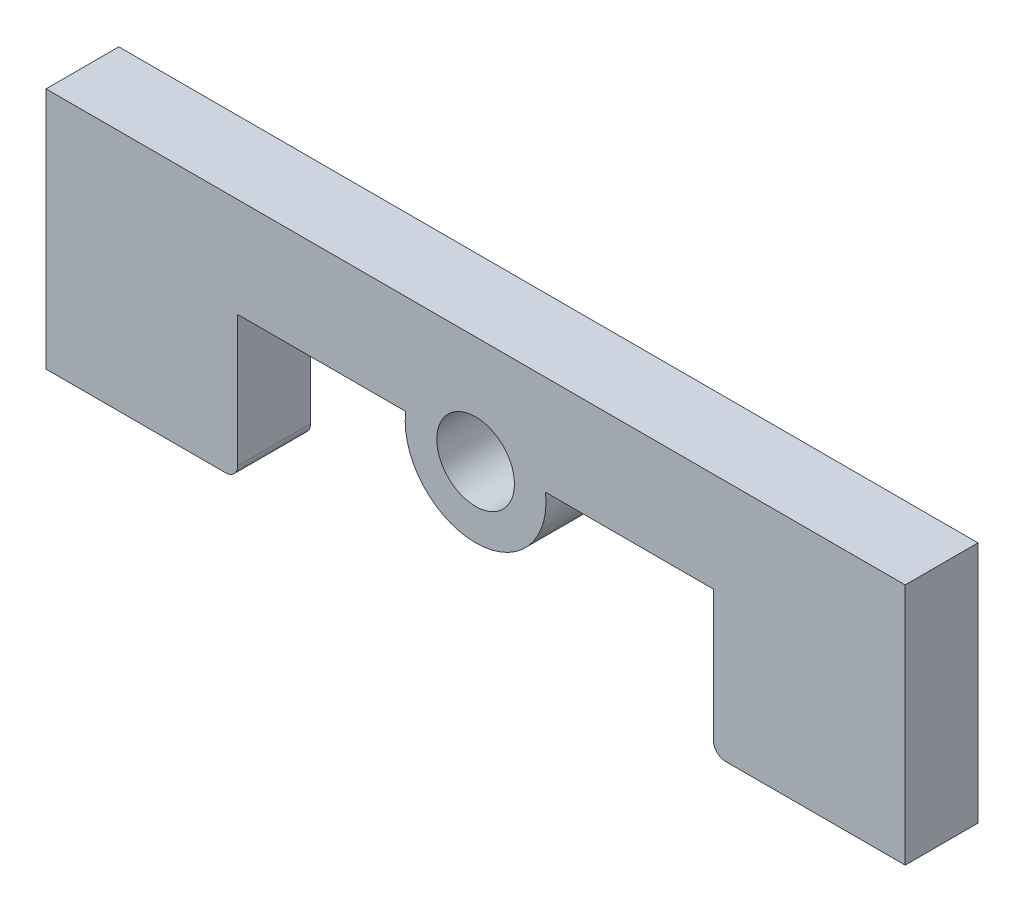
ISO-10303-21;
HEADER;
FILE_DESCRIPTION(('STEP AP214'),'2;1');
FILE_NAME('part.step','',(''),(''),'','','');
FILE_SCHEMA(('AUTOMOTIVE_DESIGN { 1 0 10303 214 1 1 1 1 }'));
ENDSEC;
DATA;
#1=APPLICATION_CONTEXT('core data for automotive mechanical design processes');
#2=APPLICATION_PROTOCOL_DEFINITION('international standard','automotive_design',2000,#1);
#3=PRODUCT_CONTEXT('',#1,'mechanical');
#4=PRODUCT('Part','Part','',(#3));
#5=PRODUCT_RELATED_PRODUCT_CATEGORY('part','',(#4));
#6=PRODUCT_DEFINITION_FORMATION('','',#4);
#7=PRODUCT_DEFINITION_CONTEXT('part definition',#1,'design');
#8=PRODUCT_DEFINITION('design','',#6,#7);
#9=PRODUCT_DEFINITION_SHAPE('','',#8);
#10=(LENGTH_UNIT() NAMED_UNIT(*) SI_UNIT(.MILLI.,.METRE.));
#11=(NAMED_UNIT(*) PLANE_ANGLE_UNIT() SI_UNIT($,.RADIAN.));
#12=(NAMED_UNIT(*) SI_UNIT($,.STERADIAN.) SOLID_ANGLE_UNIT());
#13=UNCERTAINTY_MEASURE_WITH_UNIT(LENGTH_MEASURE(1.E-05),#10,'distance_accuracy_value','');
#14=(GEOMETRIC_REPRESENTATION_CONTEXT(3) GLOBAL_UNCERTAINTY_ASSIGNED_CONTEXT((#13)) GLOBAL_UNIT_ASSIGNED_CONTEXT((#10,
#11,#12)) REPRESENTATION_CONTEXT('',''));
#15=CARTESIAN_POINT('',(0.,0.,0.));
#16=DIRECTION('',(0.,0.,1.));
#17=DIRECTION('',(1.,0.,0.));
#18=AXIS2_PLACEMENT_3D('',#15,#16,#17);
#19=CARTESIAN_POINT('',(0.,0.550000000000001,3.));
#20=DIRECTION('',(0.,0.,-1.));
#21=DIRECTION('',(-1.,0.,0.));
#22=AXIS2_PLACEMENT_3D('',#19,#20,#21);
#23=CYLINDRICAL_SURFACE('',#22,2.9);
#24=CARTESIAN_POINT('',(0.,0.550000000000001,0.));
#25=DIRECTION('',(0.,0.,1.));
#26=DIRECTION('',(1.,0.,0.));
#27=AXIS2_PLACEMENT_3D('',#24,#25,#26);
#28=CIRCLE('',#27,2.9);
#29=CARTESIAN_POINT('',(-0.536190264738173,3.4,0.));
#30=VERTEX_POINT('',#29);
#31=CARTESIAN_POINT('',(0.536190264738173,3.4,0.));
#32=VERTEX_POINT('',#31);
#33=EDGE_CURVE('E304',#30,#32,#28,.T.);
#34=ORIENTED_EDGE('',*,*,#33,.T.);
#35=CARTESIAN_POINT('',(0.536190264738173,3.4,0.));
#36=CARTESIAN_POINT('',(0.613179852837591,3.38552357550772,2.20867848946053E-05));
#37=CARTESIAN_POINT('',(0.689581978619178,3.36791166441533,0.000126316345809166));
#38=CARTESIAN_POINT('',(0.840728525690505,3.32656326663525,0.000987358538958132));
#39=CARTESIAN_POINT('',(0.915472492691188,3.30282512349613,0.00174434779852018));
#40=CARTESIAN_POINT('',(1.06327146387403,3.24919951581738,0.00440862405861728));
#41=CARTESIAN_POINT('',(1.13631178682209,3.2192718949182,0.00632358827885393));
#42=CARTESIAN_POINT('',(1.27965204308748,3.15359438186662,0.0119541408926082));
#43=CARTESIAN_POINT('',(1.34995219673533,3.11784495903338,0.015669584189836));
#44=CARTESIAN_POINT('',(1.48754274744591,3.04067483694472,0.0256508374176545));
#45=CARTESIAN_POINT('',(1.55482059482031,2.99923295465254,0.031926354421234));
#46=CARTESIAN_POINT('',(1.68550123218148,2.9112051187518,0.0478419861815382));
#47=CARTESIAN_POINT('',(1.74890456832346,2.86461989276489,0.0574816254364711));
#48=CARTESIAN_POINT('',(1.87105113050252,2.76703773076158,0.0809367256972083));
#49=CARTESIAN_POINT('',(1.9298095028361,2.71605637207538,0.0947378425028758));
#50=CARTESIAN_POINT('',(2.04232087736858,2.61031089123451,0.127353979090593));
#51=CARTESIAN_POINT('',(2.09607492688047,2.55554756477396,0.146167946577461));
#52=CARTESIAN_POINT('',(2.19229112416745,2.44957592929605,0.187091771913512));
#53=CARTESIAN_POINT('',(2.23534280538145,2.39866585303474,0.208588379672323));
#54=CARTESIAN_POINT('',(2.3168122382164,2.29548000658824,0.256504968234888));
#55=CARTESIAN_POINT('',(2.3552309064092,2.24320450902893,0.282923972575846));
#56=CARTESIAN_POINT('',(2.4272568755579,2.13822972256279,0.340943073943082));
#57=CARTESIAN_POINT('',(2.46086546451427,2.08553055111054,0.372541779114684));
#58=CARTESIAN_POINT('',(2.52324944842581,1.98071261731993,0.440983142203396));
#59=CARTESIAN_POINT('',(2.5520254359543,1.92859378455333,0.477825156161267));
#60=CARTESIAN_POINT('',(2.6232135086689,1.79027613893985,0.58407799270305));
#61=CARTESIAN_POINT('',(2.66125559654622,1.70549016980245,0.658365536876008));
#62=CARTESIAN_POINT('',(2.72541856952558,1.54479851684192,0.820335044292956));
#63=CARTESIAN_POINT('',(2.75153849310116,1.46889354964152,0.908018087127414));
#64=CARTESIAN_POINT('',(2.79450237721824,1.32858434100799,1.09534750835));
#65=CARTESIAN_POINT('',(2.81126632394306,1.26428239388743,1.19508846464049));
#66=CARTESIAN_POINT('',(2.83782219845964,1.15017524576814,1.40344984787501));
#67=CARTESIAN_POINT('',(2.84760855761432,1.10038164221089,1.51207729000739));
#68=CARTESIAN_POINT('',(2.86323434813456,1.01267919972272,1.74644741454192));
#69=CARTESIAN_POINT('',(2.86859880701772,0.976391840740433,1.87282817212578));
#70=CARTESIAN_POINT('',(2.87589140602205,0.924128047663274,2.1296274594102));
#71=CARTESIAN_POINT('',(2.87782576894013,0.908114847812271,2.26003823955568));
#72=CARTESIAN_POINT('',(2.87870122292396,0.900792871333978,2.42716524788432));
#73=CARTESIAN_POINT('',(2.87879501450787,0.899995632205481,2.46358992852101));
#74=CARTESIAN_POINT('',(2.87880183409696,0.900000000000002,2.5));
#75=B_SPLINE_CURVE_WITH_KNOTS('',3,(#35,#36,#37,#38,#39,#40,#41,#42,#43,#44,#45,#46,#47,#48,#49,
#50,#51,#52,#53,#54,#55,#56,#57,#58,#59,#60,#61,#62,#63,#64,#65,#66,#67,#68,#69,#70,#71,#72,#73,
#74),.UNSPECIFIED.,.F.,.F.,(4,2,2,2,2,2,2,2,2,2,2,2,2,2,2,2,2,2,2,4),(0.,0.234955703186627,
0.469975001942833,0.706569797000673,0.943145528621502,1.18062675151352,1.41807442121281,
1.65471281101232,1.89130156487947,2.10113764639681,2.31093214666534,2.52067036449118,
2.73038284542045,3.08542746386435,3.44050071171585,3.79856581053681,4.15691635320831,
4.5500293894838,4.9424285171533,5.05168992448615),.UNSPECIFIED.);
#76=CARTESIAN_POINT('',(2.87880183409696,0.900000000000002,2.5));
#77=VERTEX_POINT('',#76);
#78=EDGE_CURVE('E166',#32,#77,#75,.T.);
#79=ORIENTED_EDGE('',*,*,#78,.T.);
#80=DIRECTION('',(0.,0.,-1.));
#81=VECTOR('',#80,1.);
#82=CARTESIAN_POINT('',(2.87880183409696,0.900000000000002,3.));
#83=LINE('',#82,#81);
#84=CARTESIAN_POINT('',(2.87880183409696,0.900000000000002,3.));
#85=VERTEX_POINT('',#84);
#86=EDGE_CURVE('E148',#85,#77,#83,.T.);
#87=ORIENTED_EDGE('',*,*,#86,.F.);
#88=CARTESIAN_POINT('',(0.,0.550000000000001,3.));
#89=DIRECTION('',(0.,0.,1.));
#90=DIRECTION('',(1.,0.,0.));
#91=AXIS2_PLACEMENT_3D('',#88,#89,#90);
#92=CIRCLE('',#91,2.9);
#93=CARTESIAN_POINT('',(-2.87880183409696,0.900000000000002,3.));
#94=VERTEX_POINT('',#93);
#95=EDGE_CURVE('E154',#94,#85,#92,.T.);
#96=ORIENTED_EDGE('',*,*,#95,.F.);
#97=DIRECTION('',(0.,0.,-1.));
#98=VECTOR('',#97,1.);
#99=CARTESIAN_POINT('',(-2.87880183409696,0.900000000000002,3.));
#100=LINE('',#99,#98);
#101=CARTESIAN_POINT('',(-2.87880183409696,0.900000000000002,2.5));
#102=VERTEX_POINT('',#101);
#103=EDGE_CURVE('E249',#94,#102,#100,.T.);
#104=ORIENTED_EDGE('',*,*,#103,.T.);
#105=CARTESIAN_POINT('',(-2.87880183409696,0.900000000000002,2.5));
#106=CARTESIAN_POINT('',(-2.87878479789198,0.899992591794521,2.43139925979284));
#107=CARTESIAN_POINT('',(-2.87845799069955,0.902823341406329,2.36279847516492));
#108=CARTESIAN_POINT('',(-2.87706183843904,0.914108668033476,2.22606480748296));
#109=CARTESIAN_POINT('',(-2.87599245149248,0.922563562226569,2.15793195103704));
#110=CARTESIAN_POINT('',(-2.87298537898445,0.945065174508608,2.02248660328523));
#111=CARTESIAN_POINT('',(-2.87104611374204,0.959122060494674,1.9551758343366));
#112=CARTESIAN_POINT('',(-2.86605836947092,0.992718387836856,1.82197954690345));
#113=CARTESIAN_POINT('',(-2.86300992276201,1.01225766944089,1.75609398694986));
#114=CARTESIAN_POINT('',(-2.85548045023713,1.0566942656615,1.62613463972071));
#115=CARTESIAN_POINT('',(-2.8509974436776,1.08159897286879,1.56206349159145));
#116=CARTESIAN_POINT('',(-2.84020474357946,1.13653235452548,1.43631729710223));
#117=CARTESIAN_POINT('',(-2.83389515695738,1.16656072902539,1.37464211073732));
#118=CARTESIAN_POINT('',(-2.8189998667096,1.23142919886837,1.25421737714772));
#119=CARTESIAN_POINT('',(-2.81041581286905,1.26626579782545,1.19546574586494));
#120=CARTESIAN_POINT('',(-2.79048228928143,1.34036635771161,1.08136218397429));
#121=CARTESIAN_POINT('',(-2.77913445213688,1.37962769755973,1.02600827037146));
#122=CARTESIAN_POINT('',(-2.75365886033706,1.46054497460606,0.92116123076812));
#123=CARTESIAN_POINT('',(-2.73965235513912,1.50205436517073,0.871525679932177));
#124=CARTESIAN_POINT('',(-2.70819221961909,1.58816911267525,0.776227587416168));
#125=CARTESIAN_POINT('',(-2.69074024081286,1.63277297972454,0.730563157309613));
#126=CARTESIAN_POINT('',(-2.65201742839182,1.72442450672644,0.643542352155751));
#127=CARTESIAN_POINT('',(-2.63074841941179,1.77147099144391,0.602183933589956));
#128=CARTESIAN_POINT('',(-2.5841219083952,1.86725456748243,0.524013811943195));
#129=CARTESIAN_POINT('',(-2.5587647970932,1.91599149688431,0.487201674928841));
#130=CARTESIAN_POINT('',(-2.48161019124558,2.05396027548696,0.390527780440954));
#131=CARTESIAN_POINT('',(-2.42494198868355,2.1442559688447,0.3359202907429));
#132=CARTESIAN_POINT('',(-2.29769815831594,2.3227412163446,0.241738940443811));
#133=CARTESIAN_POINT('',(-2.22712114315769,2.41093055940143,0.202166580695263));
#134=CARTESIAN_POINT('',(-2.07401964857402,2.5801090077599,0.13653932401023));
#135=CARTESIAN_POINT('',(-1.99161121988731,2.66115695843771,0.110363260939201));
#136=CARTESIAN_POINT('',(-1.81615667173728,2.81387489445077,0.0683859219923984));
#137=CARTESIAN_POINT('',(-1.72310372860148,2.88553880030044,0.0525913454292905));
#138=CARTESIAN_POINT('',(-1.51519968815173,3.02628446697673,0.0269181408272839));
#139=CARTESIAN_POINT('',(-1.39910130694112,3.09371436129072,0.018124723006213));
#140=CARTESIAN_POINT('',(-1.15849592758707,3.21192646240308,0.00637439783392443));
#141=CARTESIAN_POINT('',(-1.03399101659052,3.26271278321973,0.00341604724110021));
#142=CARTESIAN_POINT('',(-0.84597808183368,3.32460137716521,0.00105919699294545));
#143=CARTESIAN_POINT('',(-0.78465888306696,3.34256017401782,0.000607859045127754));
#144=CARTESIAN_POINT('',(-0.66109137037137,3.37436124573992,8.23907392713978E-05));
#145=CARTESIAN_POINT('',(-0.598845165082471,3.38821169949171,7.50613103726745E-06));
#146=CARTESIAN_POINT('',(-0.536190264738173,3.4,0.));
#147=B_SPLINE_CURVE_WITH_KNOTS('',3,(#105,#106,#107,#108,#109,#110,#111,#112,#113,#114,#115,
#116,#117,#118,#119,#120,#121,#122,#123,#124,#125,#126,#127,#128,#129,#130,#131,#132,#133,#134,
#135,#136,#137,#138,#139,#140,#141,#142,#143,#144,#145,#146),.UNSPECIFIED.,.F.,.F.,(4,2,2,2,2,2,
2,2,2,2,2,2,2,2,2,2,2,2,2,2,4),(0.,0.2057433195896,0.411498243208283,0.617628335772472,
0.823752422514739,1.03016234848974,1.23656019496768,1.44280873864037,1.64893574287689,
1.84727373412096,2.04551688600199,2.24366552395736,2.44179523438455,2.79916754249126,
3.15657551522389,3.51069100616763,3.86503478882234,4.26716976027165,4.66920525544842,
4.86077607043157,5.05196290668739),.UNSPECIFIED.);
#148=EDGE_CURVE('E183',#102,#30,#147,.T.);
#149=ORIENTED_EDGE('',*,*,#148,.T.);
#150=EDGE_LOOP('',(#34,#79,#87,#96,#104,#149));
#151=FACE_BOUND('',#150,.T.);
#152=ADVANCED_FACE('F41',(#151),#23,.T.);
#153=CARTESIAN_POINT('',(0.,0.900000000000002,3.));
#154=DIRECTION('',(0.,1.,0.));
#155=DIRECTION('',(0.,0.,1.));
#156=AXIS2_PLACEMENT_3D('',#153,#154,#155);
#157=PLANE('',#156);
#158=ORIENTED_EDGE('',*,*,#86,.T.);
#159=DIRECTION('',(1.,0.,0.));
#160=VECTOR('',#159,1.);
#161=CARTESIAN_POINT('',(0.,0.900000000000002,2.5));
#162=LINE('',#161,#160);
#163=CARTESIAN_POINT('',(9.80000000000001,0.900000000000002,2.5));
#164=VERTEX_POINT('',#163);
#165=EDGE_CURVE('E181',#77,#164,#162,.T.);
#166=ORIENTED_EDGE('',*,*,#165,.T.);
#167=DIRECTION('',(0.,0.,-1.));
#168=VECTOR('',#167,1.);
#169=CARTESIAN_POINT('',(9.80000000000001,0.900000000000002,3.));
#170=LINE('',#169,#168);
#171=CARTESIAN_POINT('',(9.80000000000001,0.900000000000002,3.));
#172=VERTEX_POINT('',#171);
#173=EDGE_CURVE('E151',#172,#164,#170,.T.);
#174=ORIENTED_EDGE('',*,*,#173,.F.);
#175=DIRECTION('',(1.,0.,0.));
#176=VECTOR('',#175,1.);
#177=CARTESIAN_POINT('',(0.,0.900000000000002,3.));
#178=LINE('',#177,#176);
#179=EDGE_CURVE('E143',#85,#172,#178,.T.);
#180=ORIENTED_EDGE('',*,*,#179,.F.);
#181=EDGE_LOOP('',(#158,#166,#174,#180));
#182=FACE_BOUND('',#181,.T.);
#183=ADVANCED_FACE('F145',(#182),#157,.F.);
#184=CARTESIAN_POINT('',(9.80000000000001,0.,3.));
#185=DIRECTION('',(-1.,0.,0.));
#186=DIRECTION('',(0.,0.,1.));
#187=AXIS2_PLACEMENT_3D('',#184,#185,#186);
#188=PLANE('',#187);
#189=DIRECTION('',(0.,1.,0.));
#190=VECTOR('',#189,1.);
#191=CARTESIAN_POINT('',(9.80000000000001,0.,0.));
#192=LINE('',#191,#190);
#193=CARTESIAN_POINT('',(9.80000000000001,-4.5,0.));
#194=VERTEX_POINT('',#193);
#195=CARTESIAN_POINT('',(9.80000000000001,3.4,0.));
#196=VERTEX_POINT('',#195);
#197=EDGE_CURVE('E278',#194,#196,#192,.T.);
#198=ORIENTED_EDGE('',*,*,#197,.F.);
#199=DIRECTION('',(0.,0.,-1.));
#200=VECTOR('',#199,1.);
#201=CARTESIAN_POINT('',(9.80000000000001,-4.5,3.));
#202=LINE('',#201,#200);
#203=CARTESIAN_POINT('',(9.80000000000001,-4.5,3.));
#204=VERTEX_POINT('',#203);
#205=EDGE_CURVE('E223',#194,#204,#202,.F.);
#206=ORIENTED_EDGE('',*,*,#205,.T.);
#207=DIRECTION('',(0.,1.,0.));
#208=VECTOR('',#207,1.);
#209=CARTESIAN_POINT('',(9.80000000000001,0.,3.));
#210=LINE('',#209,#208);
#211=EDGE_CURVE('E153',#204,#172,#210,.T.);
#212=ORIENTED_EDGE('',*,*,#211,.T.);
#213=ORIENTED_EDGE('',*,*,#173,.T.);
#214=CARTESIAN_POINT('',(9.80000000000001,3.4,2.5));
#215=DIRECTION('',(-1.,0.,0.));
#216=DIRECTION('',(0.,0.,1.));
#217=AXIS2_PLACEMENT_3D('',#214,#215,#216);
#218=CIRCLE('',#217,2.5);
#219=EDGE_CURVE('E216',#164,#196,#218,.F.);
#220=ORIENTED_EDGE('',*,*,#219,.T.);
#221=EDGE_LOOP('',(#198,#206,#212,#213,#220));
#222=FACE_BOUND('',#221,.T.);
#223=ADVANCED_FACE('F310',(#222),#188,.T.);
#224=CARTESIAN_POINT('',(0.,-5.,3.));
#225=DIRECTION('',(0.,1.,0.));
#226=DIRECTION('',(0.,0.,1.));
#227=AXIS2_PLACEMENT_3D('',#224,#225,#226);
#228=PLANE('',#227);
#229=DIRECTION('',(1.,0.,0.));
#230=VECTOR('',#229,1.);
#231=CARTESIAN_POINT('',(0.,-5.,3.));
#232=LINE('',#231,#230);
#233=CARTESIAN_POINT('',(10.3,-5.,3.));
#234=VERTEX_POINT('',#233);
#235=CARTESIAN_POINT('',(17.7,-5.,3.));
#236=VERTEX_POINT('',#235);
#237=EDGE_CURVE('E295',#234,#236,#232,.T.);
#238=ORIENTED_EDGE('',*,*,#237,.F.);
#239=DIRECTION('',(0.,0.,-1.));
#240=VECTOR('',#239,1.);
#241=CARTESIAN_POINT('',(10.3,-5.,0.));
#242=LINE('',#241,#240);
#243=CARTESIAN_POINT('',(10.3,-5.,0.));
#244=VERTEX_POINT('',#243);
#245=EDGE_CURVE('E215',#234,#244,#242,.T.);
#246=ORIENTED_EDGE('',*,*,#245,.T.);
#247=DIRECTION('',(1.,0.,0.));
#248=VECTOR('',#247,1.);
#249=CARTESIAN_POINT('',(0.,-5.,0.));
#250=LINE('',#249,#248);
#251=CARTESIAN_POINT('',(17.7,-5.,0.));
#252=VERTEX_POINT('',#251);
#253=EDGE_CURVE('E272',#244,#252,#250,.T.);
#254=ORIENTED_EDGE('',*,*,#253,.T.);
#255=DIRECTION('',(0.,0.,-1.));
#256=VECTOR('',#255,1.);
#257=CARTESIAN_POINT('',(17.7,-5.,3.));
#258=LINE('',#257,#256);
#259=EDGE_CURVE('E172',#236,#252,#258,.T.);
#260=ORIENTED_EDGE('',*,*,#259,.F.);
#261=EDGE_LOOP('',(#238,#246,#254,#260));
#262=FACE_BOUND('',#261,.T.);
#263=ADVANCED_FACE('F317',(#262),#228,.F.);
#264=CARTESIAN_POINT('',(17.7,0.,3.));
#265=DIRECTION('',(-1.,0.,0.));
#266=DIRECTION('',(0.,0.,1.));
#267=AXIS2_PLACEMENT_3D('',#264,#265,#266);
#268=PLANE('',#267);
#269=DIRECTION('',(0.,1.,0.));
#270=VECTOR('',#269,1.);
#271=CARTESIAN_POINT('',(17.7,0.,0.));
#272=LINE('',#271,#270);
#273=CARTESIAN_POINT('',(17.7,5.,0.));
#274=VERTEX_POINT('',#273);
#275=EDGE_CURVE('E267',#252,#274,#272,.T.);
#276=ORIENTED_EDGE('',*,*,#275,.T.);
#277=DIRECTION('',(0.,0.,-1.));
#278=VECTOR('',#277,1.);
#279=CARTESIAN_POINT('',(17.7,5.,3.));
#280=LINE('',#279,#278);
#281=CARTESIAN_POINT('',(17.7,5.,3.));
#282=VERTEX_POINT('',#281);
#283=EDGE_CURVE('E258',#282,#274,#280,.T.);
#284=ORIENTED_EDGE('',*,*,#283,.F.);
#285=DIRECTION('',(0.,1.,0.));
#286=VECTOR('',#285,1.);
#287=CARTESIAN_POINT('',(17.7,0.,3.));
#288=LINE('',#287,#286);
#289=EDGE_CURVE('E269',#236,#282,#288,.T.);
#290=ORIENTED_EDGE('',*,*,#289,.F.);
#291=ORIENTED_EDGE('',*,*,#259,.T.);
#292=EDGE_LOOP('',(#276,#284,#290,#291));
#293=FACE_BOUND('',#292,.T.);
#294=ADVANCED_FACE('F265',(#293),#268,.F.);
#295=CARTESIAN_POINT('',(0.,5.,3.));
#296=DIRECTION('',(0.,1.,0.));
#297=DIRECTION('',(0.,0.,1.));
#298=AXIS2_PLACEMENT_3D('',#295,#296,#297);
#299=PLANE('',#298);
#300=DIRECTION('',(1.,0.,0.));
#301=VECTOR('',#300,1.);
#302=CARTESIAN_POINT('',(0.,5.,0.));
#303=LINE('',#302,#301);
#304=CARTESIAN_POINT('',(-17.7,5.,0.));
#305=VERTEX_POINT('',#304);
#306=EDGE_CURVE('E275',#305,#274,#303,.T.);
#307=ORIENTED_EDGE('',*,*,#306,.F.);
#308=DIRECTION('',(0.,0.,-1.));
#309=VECTOR('',#308,1.);
#310=CARTESIAN_POINT('',(-17.7,5.,3.));
#311=LINE('',#310,#309);
#312=CARTESIAN_POINT('',(-17.7,5.,3.));
#313=VERTEX_POINT('',#312);
#314=EDGE_CURVE('E256',#313,#305,#311,.T.);
#315=ORIENTED_EDGE('',*,*,#314,.F.);
#316=DIRECTION('',(1.,0.,0.));
#317=VECTOR('',#316,1.);
#318=CARTESIAN_POINT('',(0.,5.,3.));
#319=LINE('',#318,#317);
#320=EDGE_CURVE('E291',#313,#282,#319,.T.);
#321=ORIENTED_EDGE('',*,*,#320,.T.);
#322=ORIENTED_EDGE('',*,*,#283,.T.);
#323=EDGE_LOOP('',(#307,#315,#321,#322));
#324=FACE_BOUND('',#323,.T.);
#325=ADVANCED_FACE('F290',(#324),#299,.T.);
#326=CARTESIAN_POINT('',(-17.7,0.,3.));
#327=DIRECTION('',(-1.,0.,0.));
#328=DIRECTION('',(0.,0.,1.));
#329=AXIS2_PLACEMENT_3D('',#326,#327,#328);
#330=PLANE('',#329);
#331=DIRECTION('',(0.,1.,0.));
#332=VECTOR('',#331,1.);
#333=CARTESIAN_POINT('',(-17.7,0.,0.));
#334=LINE('',#333,#332);
#335=CARTESIAN_POINT('',(-17.7,-5.,0.));
#336=VERTEX_POINT('',#335);
#337=EDGE_CURVE('E245',#336,#305,#334,.T.);
#338=ORIENTED_EDGE('',*,*,#337,.F.);
#339=DIRECTION('',(0.,0.,-1.));
#340=VECTOR('',#339,1.);
#341=CARTESIAN_POINT('',(-17.7,-5.,3.));
#342=LINE('',#341,#340);
#343=CARTESIAN_POINT('',(-17.7,-5.,3.));
#344=VERTEX_POINT('',#343);
#345=EDGE_CURVE('E254',#344,#336,#342,.T.);
#346=ORIENTED_EDGE('',*,*,#345,.F.);
#347=DIRECTION('',(0.,1.,0.));
#348=VECTOR('',#347,1.);
#349=CARTESIAN_POINT('',(-17.7,0.,3.));
#350=LINE('',#349,#348);
#351=EDGE_CURVE('E286',#344,#313,#350,.T.);
#352=ORIENTED_EDGE('',*,*,#351,.T.);
#353=ORIENTED_EDGE('',*,*,#314,.T.);
#354=EDGE_LOOP('',(#338,#346,#352,#353));
#355=FACE_BOUND('',#354,.T.);
#356=ADVANCED_FACE('F283',(#355),#330,.T.);
#357=CARTESIAN_POINT('',(0.,-5.,3.));
#358=DIRECTION('',(0.,1.,0.));
#359=DIRECTION('',(0.,0.,1.));
#360=AXIS2_PLACEMENT_3D('',#357,#358,#359);
#361=PLANE('',#360);
#362=DIRECTION('',(1.,0.,0.));
#363=VECTOR('',#362,1.);
#364=CARTESIAN_POINT('',(0.,-5.,0.));
#365=LINE('',#364,#363);
#366=CARTESIAN_POINT('',(-10.3,-5.,0.));
#367=VERTEX_POINT('',#366);
#368=EDGE_CURVE('E241',#336,#367,#365,.T.);
#369=ORIENTED_EDGE('',*,*,#368,.T.);
#370=DIRECTION('',(0.,0.,-1.));
#371=VECTOR('',#370,1.);
#372=CARTESIAN_POINT('',(-10.3,-5.,3.));
#373=LINE('',#372,#371);
#374=CARTESIAN_POINT('',(-10.3,-5.,3.));
#375=VERTEX_POINT('',#374);
#376=EDGE_CURVE('E11',#367,#375,#373,.F.);
#377=ORIENTED_EDGE('',*,*,#376,.T.);
#378=DIRECTION('',(1.,0.,0.));
#379=VECTOR('',#378,1.);
#380=CARTESIAN_POINT('',(0.,-5.,3.));
#381=LINE('',#380,#379);
#382=EDGE_CURVE('E293',#344,#375,#381,.T.);
#383=ORIENTED_EDGE('',*,*,#382,.F.);
#384=ORIENTED_EDGE('',*,*,#345,.T.);
#385=EDGE_LOOP('',(#369,#377,#383,#384));
#386=FACE_BOUND('',#385,.T.);
#387=ADVANCED_FACE('F346',(#386),#361,.F.);
#388=CARTESIAN_POINT('',(-9.8,0.,3.));
#389=DIRECTION('',(-1.,0.,0.));
#390=DIRECTION('',(0.,0.,1.));
#391=AXIS2_PLACEMENT_3D('',#388,#389,#390);
#392=PLANE('',#391);
#393=DIRECTION('',(0.,1.,0.));
#394=VECTOR('',#393,1.);
#395=CARTESIAN_POINT('',(-9.8,0.,3.));
#396=LINE('',#395,#394);
#397=CARTESIAN_POINT('',(-9.8,-4.5,3.));
#398=VERTEX_POINT('',#397);
#399=CARTESIAN_POINT('',(-9.8,0.900000000000002,3.));
#400=VERTEX_POINT('',#399);
#401=EDGE_CURVE('E234',#398,#400,#396,.T.);
#402=ORIENTED_EDGE('',*,*,#401,.F.);
#403=DIRECTION('',(0.,0.,-1.));
#404=VECTOR('',#403,1.);
#405=CARTESIAN_POINT('',(-9.8,-4.5,3.));
#406=LINE('',#405,#404);
#407=CARTESIAN_POINT('',(-9.8,-4.5,0.));
#408=VERTEX_POINT('',#407);
#409=EDGE_CURVE('E49',#398,#408,#406,.T.);
#410=ORIENTED_EDGE('',*,*,#409,.T.);
#411=DIRECTION('',(0.,1.,0.));
#412=VECTOR('',#411,1.);
#413=CARTESIAN_POINT('',(-9.8,0.,0.));
#414=LINE('',#413,#412);
#415=CARTESIAN_POINT('',(-9.8,3.4,0.));
#416=VERTEX_POINT('',#415);
#417=EDGE_CURVE('E232',#408,#416,#414,.T.);
#418=ORIENTED_EDGE('',*,*,#417,.T.);
#419=CARTESIAN_POINT('',(-9.8,3.4,2.5));
#420=DIRECTION('',(-1.,0.,0.));
#421=DIRECTION('',(0.,0.,1.));
#422=AXIS2_PLACEMENT_3D('',#419,#420,#421);
#423=CIRCLE('',#422,2.5);
#424=CARTESIAN_POINT('',(-9.8,0.900000000000002,2.5));
#425=VERTEX_POINT('',#424);
#426=EDGE_CURVE('E192',#416,#425,#423,.T.);
#427=ORIENTED_EDGE('',*,*,#426,.T.);
#428=DIRECTION('',(0.,0.,-1.));
#429=VECTOR('',#428,1.);
#430=CARTESIAN_POINT('',(-9.8,0.900000000000002,3.));
#431=LINE('',#430,#429);
#432=EDGE_CURVE('E251',#400,#425,#431,.T.);
#433=ORIENTED_EDGE('',*,*,#432,.F.);
#434=EDGE_LOOP('',(#402,#410,#418,#427,#433));
#435=FACE_BOUND('',#434,.T.);
#436=ADVANCED_FACE('F231',(#435),#392,.F.);
#437=CARTESIAN_POINT('',(0.,0.550000000000001,3.));
#438=DIRECTION('',(0.,0.,-1.));
#439=DIRECTION('',(-1.,0.,0.));
#440=AXIS2_PLACEMENT_3D('',#437,#438,#439);
#441=CYLINDRICAL_SURFACE('',#440,1.6);
#442=CARTESIAN_POINT('',(0.,0.550000000000001,3.));
#443=DIRECTION('',(0.,0.,1.));
#444=DIRECTION('',(1.,0.,0.));
#445=AXIS2_PLACEMENT_3D('',#442,#443,#444);
#446=CIRCLE('',#445,1.6);
#447=CARTESIAN_POINT('',(1.6,0.550000000000001,3.));
#448=VERTEX_POINT('',#447);
#449=EDGE_CURVE('E163',#448,#448,#446,.T.);
#450=ORIENTED_EDGE('',*,*,#449,.T.);
#451=EDGE_LOOP('',(#450));
#452=FACE_BOUND('',#451,.T.);
#453=CARTESIAN_POINT('',(0.,0.550000000000001,0.));
#454=DIRECTION('',(0.,0.,1.));
#455=DIRECTION('',(1.,0.,0.));
#456=AXIS2_PLACEMENT_3D('',#453,#454,#455);
#457=CIRCLE('',#456,1.6);
#458=CARTESIAN_POINT('',(1.6,0.550000000000001,0.));
#459=VERTEX_POINT('',#458);
#460=EDGE_CURVE('E301',#459,#459,#457,.T.);
#461=ORIENTED_EDGE('',*,*,#460,.F.);
#462=EDGE_LOOP('',(#461));
#463=FACE_BOUND('',#462,.T.);
#464=ADVANCED_FACE('F204',(#452,#463),#441,.F.);
#465=ORIENTED_EDGE('',*,*,#432,.T.);
#466=DIRECTION('',(1.,0.,0.));
#467=VECTOR('',#466,1.);
#468=CARTESIAN_POINT('',(0.,0.900000000000002,2.5));
#469=LINE('',#468,#467);
#470=EDGE_CURVE('E167',#425,#102,#469,.T.);
#471=ORIENTED_EDGE('',*,*,#470,.T.);
#472=ORIENTED_EDGE('',*,*,#103,.F.);
#473=EDGE_CURVE('E156',#400,#94,#178,.T.);
#474=ORIENTED_EDGE('',*,*,#473,.F.);
#475=EDGE_LOOP('',(#465,#471,#472,#474));
#476=FACE_BOUND('',#475,.T.);
#477=ADVANCED_FACE('F313',(#476),#157,.F.);
#478=CARTESIAN_POINT('',(0.,0.,3.));
#479=DIRECTION('',(0.,0.,1.));
#480=DIRECTION('',(1.,0.,0.));
#481=AXIS2_PLACEMENT_3D('',#478,#479,#480);
#482=PLANE('',#481);
#483=ORIENTED_EDGE('',*,*,#449,.F.);
#484=EDGE_LOOP('',(#483));
#485=FACE_BOUND('',#484,.T.);
#486=ORIENTED_EDGE('',*,*,#211,.F.);
#487=CARTESIAN_POINT('',(10.3,-4.5,3.));
#488=DIRECTION('',(0.,0.,1.));
#489=DIRECTION('',(1.,0.,0.));
#490=AXIS2_PLACEMENT_3D('',#487,#488,#489);
#491=CIRCLE('',#490,0.5);
#492=EDGE_CURVE('E226',#204,#234,#491,.T.);
#493=ORIENTED_EDGE('',*,*,#492,.T.);
#494=ORIENTED_EDGE('',*,*,#237,.T.);
#495=ORIENTED_EDGE('',*,*,#289,.T.);
#496=ORIENTED_EDGE('',*,*,#320,.F.);
#497=ORIENTED_EDGE('',*,*,#351,.F.);
#498=ORIENTED_EDGE('',*,*,#382,.T.);
#499=CARTESIAN_POINT('',(-10.3,-4.5,3.));
#500=DIRECTION('',(0.,0.,1.));
#501=DIRECTION('',(1.,0.,0.));
#502=AXIS2_PLACEMENT_3D('',#499,#500,#501);
#503=CIRCLE('',#502,0.5);
#504=EDGE_CURVE('E56',#375,#398,#503,.T.);
#505=ORIENTED_EDGE('',*,*,#504,.T.);
#506=ORIENTED_EDGE('',*,*,#401,.T.);
#507=ORIENTED_EDGE('',*,*,#473,.T.);
#508=ORIENTED_EDGE('',*,*,#95,.T.);
#509=ORIENTED_EDGE('',*,*,#179,.T.);
#510=EDGE_LOOP('',(#486,#493,#494,#495,#496,#497,#498,#505,#506,#507,#508,#509));
#511=FACE_BOUND('',#510,.T.);
#512=ADVANCED_FACE('F158',(#485,#511),#482,.T.);
#513=CARTESIAN_POINT('',(0.,0.,0.));
#514=DIRECTION('',(0.,0.,1.));
#515=DIRECTION('',(1.,0.,0.));
#516=AXIS2_PLACEMENT_3D('',#513,#514,#515);
#517=PLANE('',#516);
#518=ORIENTED_EDGE('',*,*,#460,.T.);
#519=EDGE_LOOP('',(#518));
#520=FACE_BOUND('',#519,.T.);
#521=ORIENTED_EDGE('',*,*,#253,.F.);
#522=CARTESIAN_POINT('',(10.3,-4.5,0.));
#523=DIRECTION('',(0.,0.,1.));
#524=DIRECTION('',(1.,0.,0.));
#525=AXIS2_PLACEMENT_3D('',#522,#523,#524);
#526=CIRCLE('',#525,0.5);
#527=EDGE_CURVE('E221',#244,#194,#526,.F.);
#528=ORIENTED_EDGE('',*,*,#527,.T.);
#529=ORIENTED_EDGE('',*,*,#197,.T.);
#530=DIRECTION('',(1.,0.,0.));
#531=VECTOR('',#530,1.);
#532=CARTESIAN_POINT('',(0.,3.4,0.));
#533=LINE('',#532,#531);
#534=EDGE_CURVE('E170',#196,#32,#533,.F.);
#535=ORIENTED_EDGE('',*,*,#534,.T.);
#536=ORIENTED_EDGE('',*,*,#33,.F.);
#537=DIRECTION('',(1.,0.,0.));
#538=VECTOR('',#537,1.);
#539=CARTESIAN_POINT('',(0.,3.4,0.));
#540=LINE('',#539,#538);
#541=EDGE_CURVE('E178',#30,#416,#540,.F.);
#542=ORIENTED_EDGE('',*,*,#541,.T.);
#543=ORIENTED_EDGE('',*,*,#417,.F.);
#544=CARTESIAN_POINT('',(-10.3,-4.5,0.));
#545=DIRECTION('',(0.,0.,1.));
#546=DIRECTION('',(1.,0.,0.));
#547=AXIS2_PLACEMENT_3D('',#544,#545,#546);
#548=CIRCLE('',#547,0.5);
#549=EDGE_CURVE('E219',#408,#367,#548,.F.);
#550=ORIENTED_EDGE('',*,*,#549,.T.);
#551=ORIENTED_EDGE('',*,*,#368,.F.);
#552=ORIENTED_EDGE('',*,*,#337,.T.);
#553=ORIENTED_EDGE('',*,*,#306,.T.);
#554=ORIENTED_EDGE('',*,*,#275,.F.);
#555=EDGE_LOOP('',(#521,#528,#529,#535,#536,#542,#543,#550,#551,#552,#553,#554));
#556=FACE_BOUND('',#555,.T.);
#557=ADVANCED_FACE('F202',(#520,#556),#517,.F.);
#558=CARTESIAN_POINT('',(0.,3.4,2.5));
#559=DIRECTION('',(1.,0.,0.));
#560=DIRECTION('',(0.,0.,-1.));
#561=AXIS2_PLACEMENT_3D('',#558,#559,#560);
#562=CYLINDRICAL_SURFACE('',#561,2.5);
#563=ORIENTED_EDGE('',*,*,#426,.F.);
#564=ORIENTED_EDGE('',*,*,#541,.F.);
#565=ORIENTED_EDGE('',*,*,#148,.F.);
#566=ORIENTED_EDGE('',*,*,#470,.F.);
#567=EDGE_LOOP('',(#563,#564,#565,#566));
#568=FACE_BOUND('',#567,.T.);
#569=ADVANCED_FACE('F197',(#568),#562,.T.);
#570=CARTESIAN_POINT('',(0.,3.4,2.5));
#571=DIRECTION('',(1.,0.,0.));
#572=DIRECTION('',(0.,0.,-1.));
#573=AXIS2_PLACEMENT_3D('',#570,#571,#572);
#574=CYLINDRICAL_SURFACE('',#573,2.5);
#575=ORIENTED_EDGE('',*,*,#78,.F.);
#576=ORIENTED_EDGE('',*,*,#534,.F.);
#577=ORIENTED_EDGE('',*,*,#219,.F.);
#578=ORIENTED_EDGE('',*,*,#165,.F.);
#579=EDGE_LOOP('',(#575,#576,#577,#578));
#580=FACE_BOUND('',#579,.T.);
#581=ADVANCED_FACE('F201',(#580),#574,.T.);
#582=CARTESIAN_POINT('',(10.3,-4.5,3.));
#583=DIRECTION('',(0.,0.,1.));
#584=DIRECTION('',(1.,0.,0.));
#585=AXIS2_PLACEMENT_3D('',#582,#583,#584);
#586=CYLINDRICAL_SURFACE('',#585,0.5);
#587=ORIENTED_EDGE('',*,*,#492,.F.);
#588=ORIENTED_EDGE('',*,*,#205,.F.);
#589=ORIENTED_EDGE('',*,*,#527,.F.);
#590=ORIENTED_EDGE('',*,*,#245,.F.);
#591=EDGE_LOOP('',(#587,#588,#589,#590));
#592=FACE_BOUND('',#591,.T.);
#593=ADVANCED_FACE('F207',(#592),#586,.T.);
#594=CARTESIAN_POINT('',(-10.3,-4.5,3.));
#595=DIRECTION('',(0.,0.,-1.));
#596=DIRECTION('',(-1.,0.,0.));
#597=AXIS2_PLACEMENT_3D('',#594,#595,#596);
#598=CYLINDRICAL_SURFACE('',#597,0.5);
#599=ORIENTED_EDGE('',*,*,#504,.F.);
#600=ORIENTED_EDGE('',*,*,#376,.F.);
#601=ORIENTED_EDGE('',*,*,#549,.F.);
#602=ORIENTED_EDGE('',*,*,#409,.F.);
#603=EDGE_LOOP('',(#599,#600,#601,#602));
#604=FACE_BOUND('',#603,.T.);
#605=ADVANCED_FACE('F43',(#604),#598,.T.);
#606=CLOSED_SHELL('',(#152,#183,#223,#263,#294,#325,#356,#387,#436,#464,#477,#512,#557,#569,
#581,#593,#605));
#607=MANIFOLD_SOLID_BREP('B2',#606);
#608=ADVANCED_BREP_SHAPE_REPRESENTATION('',(#18,#607),#14);
#609=SHAPE_DEFINITION_REPRESENTATION(#9,#608);
ENDSEC;
END-ISO-10303-21;
